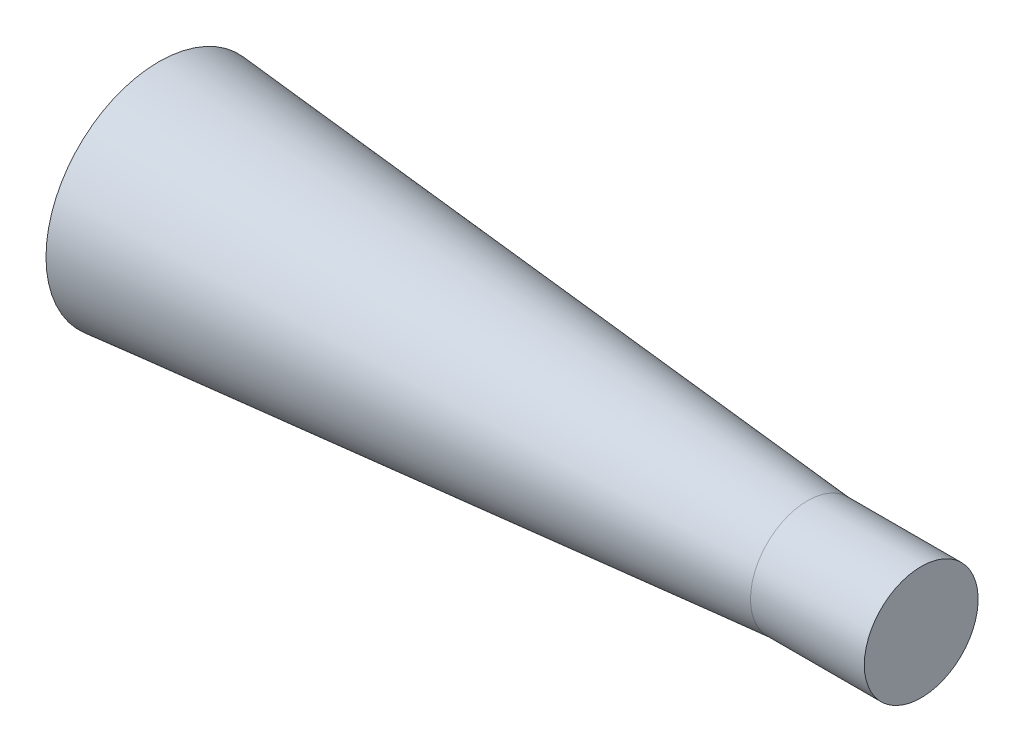
ISO-10303-21;
HEADER;
FILE_DESCRIPTION(('STEP AP214'),'2;1');
FILE_NAME('part.step','',(''),(''),'','','');
FILE_SCHEMA(('AUTOMOTIVE_DESIGN { 1 0 10303 214 1 1 1 1 }'));
ENDSEC;
DATA;
#1=APPLICATION_CONTEXT('core data for automotive mechanical design processes');
#2=APPLICATION_PROTOCOL_DEFINITION('international standard','automotive_design',2000,#1);
#3=PRODUCT_CONTEXT('',#1,'mechanical');
#4=PRODUCT('Part','Part','',(#3));
#5=PRODUCT_RELATED_PRODUCT_CATEGORY('part','',(#4));
#6=PRODUCT_DEFINITION_FORMATION('','',#4);
#7=PRODUCT_DEFINITION_CONTEXT('part definition',#1,'design');
#8=PRODUCT_DEFINITION('design','',#6,#7);
#9=PRODUCT_DEFINITION_SHAPE('','',#8);
#10=(LENGTH_UNIT() NAMED_UNIT(*) SI_UNIT(.MILLI.,.METRE.));
#11=(NAMED_UNIT(*) PLANE_ANGLE_UNIT() SI_UNIT($,.RADIAN.));
#12=(NAMED_UNIT(*) SI_UNIT($,.STERADIAN.) SOLID_ANGLE_UNIT());
#13=UNCERTAINTY_MEASURE_WITH_UNIT(LENGTH_MEASURE(1.E-05),#10,'distance_accuracy_value','');
#14=(GEOMETRIC_REPRESENTATION_CONTEXT(3) GLOBAL_UNCERTAINTY_ASSIGNED_CONTEXT((#13)) GLOBAL_UNIT_ASSIGNED_CONTEXT((#10,
#11,#12)) REPRESENTATION_CONTEXT('',''));
#15=CARTESIAN_POINT('',(0.,0.,0.));
#16=DIRECTION('',(0.,0.,1.));
#17=DIRECTION('',(1.,0.,0.));
#18=AXIS2_PLACEMENT_3D('',#15,#16,#17);
#19=CARTESIAN_POINT('',(24.8208234244947,0.,0.));
#20=DIRECTION('',(-1.,0.,0.));
#21=DIRECTION('',(0.,1.,0.));
#22=AXIS2_PLACEMENT_3D('',#19,#20,#21);
#23=SPHERICAL_SURFACE('',#22,24.8208234244947);
#24=CARTESIAN_POINT('',(0.5,0.,0.));
#25=DIRECTION('',(-1.,0.,0.));
#26=DIRECTION('',(0.,0.,1.));
#27=AXIS2_PLACEMENT_3D('',#24,#25,#26);
#28=CIRCLE('',#27,4.95689655172414);
#29=CARTESIAN_POINT('',(0.5,0.,4.95689655172414));
#30=VERTEX_POINT('',#29);
#31=EDGE_CURVE('E57',#30,#30,#28,.T.);
#32=ORIENTED_EDGE('',*,*,#31,.T.);
#33=EDGE_LOOP('',(#32));
#34=FACE_BOUND('',#33,.T.);
#35=ADVANCED_FACE('F45',(#34),#23,.T.);
#36=CARTESIAN_POINT('',(34.,0.,0.));
#37=DIRECTION('',(1.,0.,0.));
#38=DIRECTION('',(0.,0.,-1.));
#39=AXIS2_PLACEMENT_3D('',#36,#37,#38);
#40=PLANE('',#39);
#41=CARTESIAN_POINT('',(34.,0.,0.));
#42=DIRECTION('',(-1.,0.,0.));
#43=DIRECTION('',(0.,0.,1.));
#44=AXIS2_PLACEMENT_3D('',#41,#42,#43);
#45=CIRCLE('',#44,2.5);
#46=CARTESIAN_POINT('',(34.,0.,2.5));
#47=VERTEX_POINT('',#46);
#48=EDGE_CURVE('E10',#47,#47,#45,.T.);
#49=ORIENTED_EDGE('',*,*,#48,.F.);
#50=EDGE_LOOP('',(#49));
#51=FACE_BOUND('',#50,.T.);
#52=ADVANCED_FACE('F73',(#51),#40,.T.);
#53=CARTESIAN_POINT('',(0.,0.,0.));
#54=DIRECTION('',(-1.,0.,0.));
#55=DIRECTION('',(0.,0.,1.));
#56=AXIS2_PLACEMENT_3D('',#53,#54,#55);
#57=CYLINDRICAL_SURFACE('',#56,2.5);
#58=ORIENTED_EDGE('',*,*,#48,.T.);
#59=EDGE_LOOP('',(#58));
#60=FACE_BOUND('',#59,.T.);
#61=CARTESIAN_POINT('',(29.,0.,0.));
#62=DIRECTION('',(-1.,0.,0.));
#63=DIRECTION('',(0.,0.,1.));
#64=AXIS2_PLACEMENT_3D('',#61,#62,#63);
#65=CIRCLE('',#64,2.5);
#66=CARTESIAN_POINT('',(29.,0.,2.5));
#67=VERTEX_POINT('',#66);
#68=EDGE_CURVE('E52',#67,#67,#65,.T.);
#69=ORIENTED_EDGE('',*,*,#68,.F.);
#70=EDGE_LOOP('',(#69));
#71=FACE_BOUND('',#70,.T.);
#72=ADVANCED_FACE('F68',(#60,#71),#57,.T.);
#73=CARTESIAN_POINT('',(29.,0.,0.));
#74=DIRECTION('',(-1.,0.,0.));
#75=DIRECTION('',(0.,0.,1.));
#76=AXIS2_PLACEMENT_3D('',#73,#74,#75);
#77=CONICAL_SURFACE('',#76,2.5,0.0859942911942407);
#78=ORIENTED_EDGE('',*,*,#31,.F.);
#79=EDGE_LOOP('',(#78));
#80=FACE_BOUND('',#79,.T.);
#81=ORIENTED_EDGE('',*,*,#68,.T.);
#82=EDGE_LOOP('',(#81));
#83=FACE_BOUND('',#82,.T.);
#84=ADVANCED_FACE('F66',(#80,#83),#77,.T.);
#85=CLOSED_SHELL('',(#35,#52,#72,#84));
#86=MANIFOLD_SOLID_BREP('B2',#85);
#87=ADVANCED_BREP_SHAPE_REPRESENTATION('',(#18,#86),#14);
#88=SHAPE_DEFINITION_REPRESENTATION(#9,#87);
ENDSEC;
END-ISO-10303-21;
